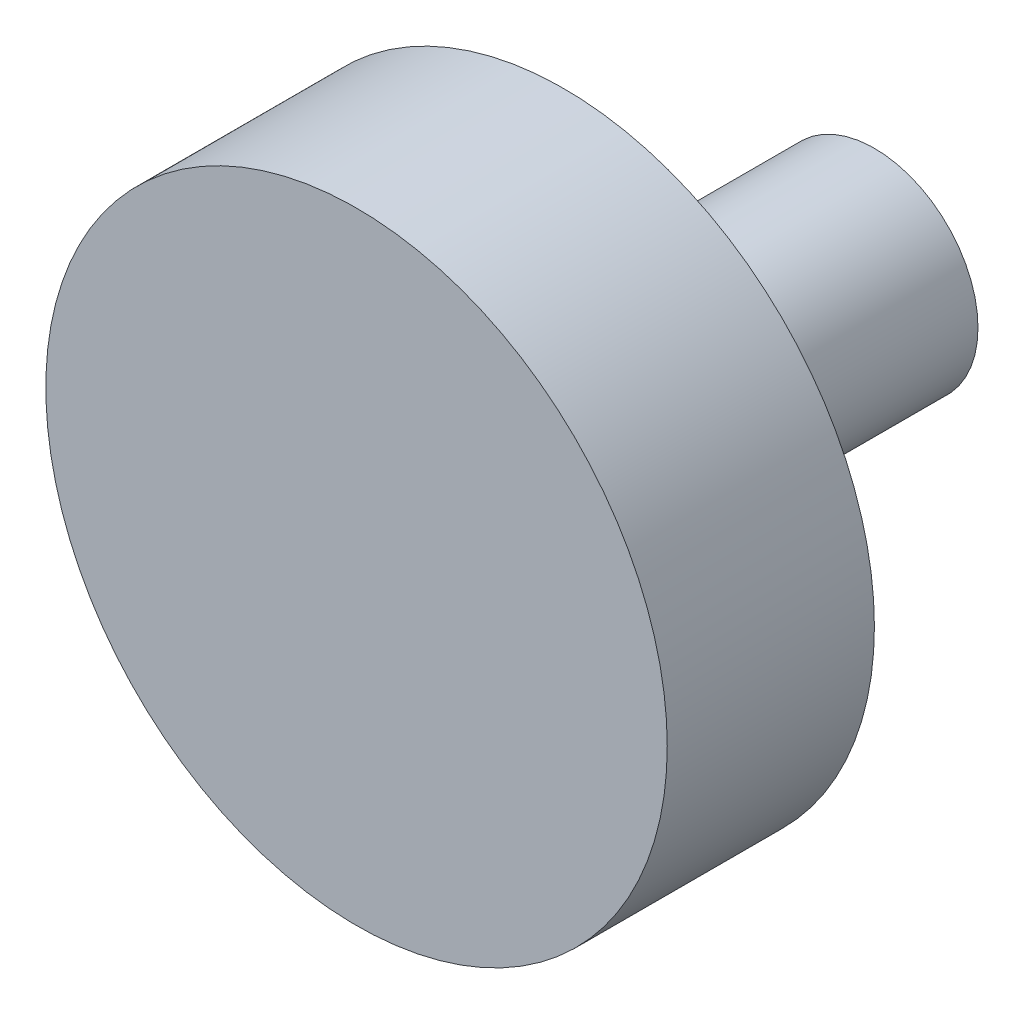
ISO-10303-21;
HEADER;
FILE_DESCRIPTION(('STEP AP214'),'2;1');
FILE_NAME('part.step','',(''),(''),'','','');
FILE_SCHEMA(('AUTOMOTIVE_DESIGN { 1 0 10303 214 1 1 1 1 }'));
ENDSEC;
DATA;
#1=APPLICATION_CONTEXT('core data for automotive mechanical design processes');
#2=APPLICATION_PROTOCOL_DEFINITION('international standard','automotive_design',2000,#1);
#3=PRODUCT_CONTEXT('',#1,'mechanical');
#4=PRODUCT('Part','Part','',(#3));
#5=PRODUCT_RELATED_PRODUCT_CATEGORY('part','',(#4));
#6=PRODUCT_DEFINITION_FORMATION('','',#4);
#7=PRODUCT_DEFINITION_CONTEXT('part definition',#1,'design');
#8=PRODUCT_DEFINITION('design','',#6,#7);
#9=PRODUCT_DEFINITION_SHAPE('','',#8);
#10=(LENGTH_UNIT() NAMED_UNIT(*) SI_UNIT(.MILLI.,.METRE.));
#11=(NAMED_UNIT(*) PLANE_ANGLE_UNIT() SI_UNIT($,.RADIAN.));
#12=(NAMED_UNIT(*) SI_UNIT($,.STERADIAN.) SOLID_ANGLE_UNIT());
#13=UNCERTAINTY_MEASURE_WITH_UNIT(LENGTH_MEASURE(1.E-05),#10,'distance_accuracy_value','');
#14=(GEOMETRIC_REPRESENTATION_CONTEXT(3) GLOBAL_UNCERTAINTY_ASSIGNED_CONTEXT((#13)) GLOBAL_UNIT_ASSIGNED_CONTEXT((#10,
#11,#12)) REPRESENTATION_CONTEXT('',''));
#15=CARTESIAN_POINT('',(0.,0.,0.));
#16=DIRECTION('',(0.,0.,1.));
#17=DIRECTION('',(1.,0.,0.));
#18=AXIS2_PLACEMENT_3D('',#15,#16,#17);
#19=CARTESIAN_POINT('',(0.,0.,7.5));
#20=DIRECTION('',(0.,0.,-1.));
#21=DIRECTION('',(-1.,0.,0.));
#22=AXIS2_PLACEMENT_3D('',#19,#20,#21);
#23=CYLINDRICAL_SURFACE('',#22,2.5);
#24=CARTESIAN_POINT('',(0.,0.,7.5));
#25=DIRECTION('',(0.,0.,1.));
#26=DIRECTION('',(1.,0.,0.));
#27=AXIS2_PLACEMENT_3D('',#24,#25,#26);
#28=CIRCLE('',#27,2.5);
#29=CARTESIAN_POINT('',(2.5,0.,7.5));
#30=VERTEX_POINT('',#29);
#31=EDGE_CURVE('E10',#30,#30,#28,.T.);
#32=ORIENTED_EDGE('',*,*,#31,.F.);
#33=EDGE_LOOP('',(#32));
#34=FACE_BOUND('',#33,.T.);
#35=CARTESIAN_POINT('',(0.,0.,0.));
#36=DIRECTION('',(0.,0.,1.));
#37=DIRECTION('',(1.,0.,0.));
#38=AXIS2_PLACEMENT_3D('',#35,#36,#37);
#39=CIRCLE('',#38,2.5);
#40=CARTESIAN_POINT('',(2.5,0.,0.));
#41=VERTEX_POINT('',#40);
#42=EDGE_CURVE('E40',#41,#41,#39,.T.);
#43=ORIENTED_EDGE('',*,*,#42,.T.);
#44=EDGE_LOOP('',(#43));
#45=FACE_BOUND('',#44,.T.);
#46=ADVANCED_FACE('F37',(#34,#45),#23,.T.);
#47=CARTESIAN_POINT('',(0.,0.,0.));
#48=DIRECTION('',(0.,0.,1.));
#49=DIRECTION('',(1.,0.,0.));
#50=AXIS2_PLACEMENT_3D('',#47,#48,#49);
#51=PLANE('',#50);
#52=ORIENTED_EDGE('',*,*,#42,.F.);
#53=EDGE_LOOP('',(#52));
#54=FACE_BOUND('',#53,.T.);
#55=ADVANCED_FACE('F60',(#54),#51,.F.);
#56=CARTESIAN_POINT('',(0.,0.,12.5));
#57=DIRECTION('',(0.,0.,-1.));
#58=DIRECTION('',(-1.,0.,0.));
#59=AXIS2_PLACEMENT_3D('',#56,#57,#58);
#60=CYLINDRICAL_SURFACE('',#59,7.5);
#61=CARTESIAN_POINT('',(0.,0.,12.5));
#62=DIRECTION('',(0.,0.,1.));
#63=DIRECTION('',(1.,0.,0.));
#64=AXIS2_PLACEMENT_3D('',#61,#62,#63);
#65=CIRCLE('',#64,7.5);
#66=CARTESIAN_POINT('',(7.5,0.,12.5));
#67=VERTEX_POINT('',#66);
#68=EDGE_CURVE('E47',#67,#67,#65,.T.);
#69=ORIENTED_EDGE('',*,*,#68,.F.);
#70=EDGE_LOOP('',(#69));
#71=FACE_BOUND('',#70,.T.);
#72=CARTESIAN_POINT('',(0.,0.,7.5));
#73=DIRECTION('',(0.,0.,1.));
#74=DIRECTION('',(1.,0.,0.));
#75=AXIS2_PLACEMENT_3D('',#72,#73,#74);
#76=CIRCLE('',#75,7.5);
#77=CARTESIAN_POINT('',(7.5,0.,7.5));
#78=VERTEX_POINT('',#77);
#79=EDGE_CURVE('E49',#78,#78,#76,.T.);
#80=ORIENTED_EDGE('',*,*,#79,.T.);
#81=EDGE_LOOP('',(#80));
#82=FACE_BOUND('',#81,.T.);
#83=ADVANCED_FACE('F57',(#71,#82),#60,.T.);
#84=CARTESIAN_POINT('',(0.,0.,12.5));
#85=DIRECTION('',(0.,0.,1.));
#86=DIRECTION('',(1.,0.,0.));
#87=AXIS2_PLACEMENT_3D('',#84,#85,#86);
#88=PLANE('',#87);
#89=ORIENTED_EDGE('',*,*,#68,.T.);
#90=EDGE_LOOP('',(#89));
#91=FACE_BOUND('',#90,.T.);
#92=ADVANCED_FACE('F55',(#91),#88,.T.);
#93=CARTESIAN_POINT('',(0.,0.,7.5));
#94=DIRECTION('',(0.,0.,1.));
#95=DIRECTION('',(1.,0.,0.));
#96=AXIS2_PLACEMENT_3D('',#93,#94,#95);
#97=PLANE('',#96);
#98=ORIENTED_EDGE('',*,*,#31,.T.);
#99=EDGE_LOOP('',(#98));
#100=FACE_BOUND('',#99,.T.);
#101=ORIENTED_EDGE('',*,*,#79,.F.);
#102=EDGE_LOOP('',(#101));
#103=FACE_BOUND('',#102,.T.);
#104=ADVANCED_FACE('F64',(#100,#103),#97,.F.);
#105=CLOSED_SHELL('',(#46,#55,#83,#92,#104));
#106=MANIFOLD_SOLID_BREP('B2',#105);
#107=ADVANCED_BREP_SHAPE_REPRESENTATION('',(#18,#106),#14);
#108=SHAPE_DEFINITION_REPRESENTATION(#9,#107);
ENDSEC;
END-ISO-10303-21;
